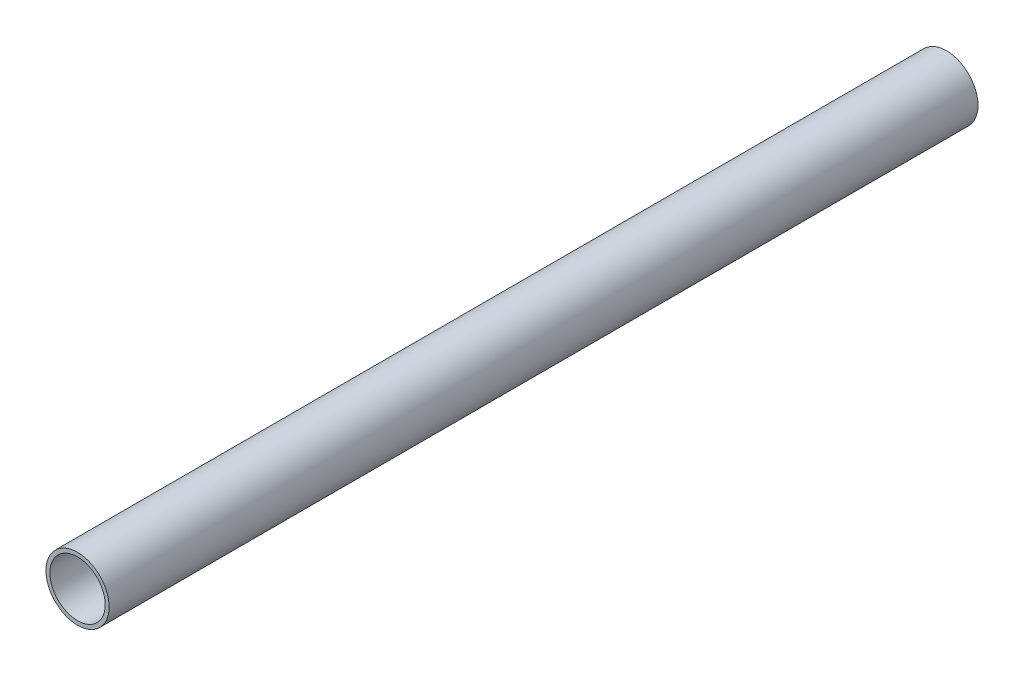
ISO-10303-21;
HEADER;
FILE_DESCRIPTION(('STEP AP214'),'2;1');
FILE_NAME('part.step','',(''),(''),'','','');
FILE_SCHEMA(('AUTOMOTIVE_DESIGN { 1 0 10303 214 1 1 1 1 }'));
ENDSEC;
DATA;
#1=APPLICATION_CONTEXT('core data for automotive mechanical design processes');
#2=APPLICATION_PROTOCOL_DEFINITION('international standard','automotive_design',2000,#1);
#3=PRODUCT_CONTEXT('',#1,'mechanical');
#4=PRODUCT('Part','Part','',(#3));
#5=PRODUCT_RELATED_PRODUCT_CATEGORY('part','',(#4));
#6=PRODUCT_DEFINITION_FORMATION('','',#4);
#7=PRODUCT_DEFINITION_CONTEXT('part definition',#1,'design');
#8=PRODUCT_DEFINITION('design','',#6,#7);
#9=PRODUCT_DEFINITION_SHAPE('','',#8);
#10=(LENGTH_UNIT() NAMED_UNIT(*) SI_UNIT(.MILLI.,.METRE.));
#11=(NAMED_UNIT(*) PLANE_ANGLE_UNIT() SI_UNIT($,.RADIAN.));
#12=(NAMED_UNIT(*) SI_UNIT($,.STERADIAN.) SOLID_ANGLE_UNIT());
#13=UNCERTAINTY_MEASURE_WITH_UNIT(LENGTH_MEASURE(1.E-05),#10,'distance_accuracy_value','');
#14=(GEOMETRIC_REPRESENTATION_CONTEXT(3) GLOBAL_UNCERTAINTY_ASSIGNED_CONTEXT((#13)) GLOBAL_UNIT_ASSIGNED_CONTEXT((#10,
#11,#12)) REPRESENTATION_CONTEXT('',''));
#15=CARTESIAN_POINT('',(0.,0.,0.));
#16=DIRECTION('',(0.,0.,1.));
#17=DIRECTION('',(1.,0.,0.));
#18=AXIS2_PLACEMENT_3D('',#15,#16,#17);
#19=CARTESIAN_POINT('',(0.,0.,110.));
#20=DIRECTION('',(0.,0.,1.));
#21=DIRECTION('',(1.,0.,0.));
#22=AXIS2_PLACEMENT_3D('',#19,#20,#21);
#23=PLANE('',#22);
#24=CARTESIAN_POINT('',(0.,0.,110.));
#25=DIRECTION('',(0.,0.,1.));
#26=DIRECTION('',(1.,0.,0.));
#27=AXIS2_PLACEMENT_3D('',#24,#25,#26);
#28=CIRCLE('',#27,8.);
#29=CARTESIAN_POINT('',(8.,0.,110.));
#30=VERTEX_POINT('',#29);
#31=EDGE_CURVE('E10',#30,#30,#28,.T.);
#32=ORIENTED_EDGE('',*,*,#31,.T.);
#33=EDGE_LOOP('',(#32));
#34=FACE_BOUND('',#33,.T.);
#35=CARTESIAN_POINT('',(0.,0.,110.));
#36=DIRECTION('',(0.,0.,1.));
#37=DIRECTION('',(1.,0.,0.));
#38=AXIS2_PLACEMENT_3D('',#35,#36,#37);
#39=CIRCLE('',#38,7.);
#40=CARTESIAN_POINT('',(7.,0.,110.));
#41=VERTEX_POINT('',#40);
#42=EDGE_CURVE('E44',#41,#41,#39,.T.);
#43=ORIENTED_EDGE('',*,*,#42,.F.);
#44=EDGE_LOOP('',(#43));
#45=FACE_BOUND('',#44,.T.);
#46=ADVANCED_FACE('F33',(#34,#45),#23,.T.);
#47=CARTESIAN_POINT('',(0.,0.,-110.));
#48=DIRECTION('',(0.,0.,1.));
#49=DIRECTION('',(1.,0.,0.));
#50=AXIS2_PLACEMENT_3D('',#47,#48,#49);
#51=PLANE('',#50);
#52=CARTESIAN_POINT('',(0.,0.,-110.));
#53=DIRECTION('',(0.,0.,1.));
#54=DIRECTION('',(1.,0.,0.));
#55=AXIS2_PLACEMENT_3D('',#52,#53,#54);
#56=CIRCLE('',#55,8.);
#57=CARTESIAN_POINT('',(8.,0.,-110.));
#58=VERTEX_POINT('',#57);
#59=EDGE_CURVE('E37',#58,#58,#56,.T.);
#60=ORIENTED_EDGE('',*,*,#59,.F.);
#61=EDGE_LOOP('',(#60));
#62=FACE_BOUND('',#61,.T.);
#63=CARTESIAN_POINT('',(0.,0.,-110.));
#64=DIRECTION('',(0.,0.,1.));
#65=DIRECTION('',(1.,0.,0.));
#66=AXIS2_PLACEMENT_3D('',#63,#64,#65);
#67=CIRCLE('',#66,7.);
#68=CARTESIAN_POINT('',(7.,0.,-110.));
#69=VERTEX_POINT('',#68);
#70=EDGE_CURVE('E46',#69,#69,#67,.T.);
#71=ORIENTED_EDGE('',*,*,#70,.T.);
#72=EDGE_LOOP('',(#71));
#73=FACE_BOUND('',#72,.T.);
#74=ADVANCED_FACE('F56',(#62,#73),#51,.F.);
#75=CARTESIAN_POINT('',(0.,0.,110.));
#76=DIRECTION('',(0.,0.,-1.));
#77=DIRECTION('',(-1.,0.,0.));
#78=AXIS2_PLACEMENT_3D('',#75,#76,#77);
#79=CYLINDRICAL_SURFACE('',#78,8.);
#80=ORIENTED_EDGE('',*,*,#31,.F.);
#81=EDGE_LOOP('',(#80));
#82=FACE_BOUND('',#81,.T.);
#83=ORIENTED_EDGE('',*,*,#59,.T.);
#84=EDGE_LOOP('',(#83));
#85=FACE_BOUND('',#84,.T.);
#86=ADVANCED_FACE('F35',(#82,#85),#79,.T.);
#87=CARTESIAN_POINT('',(0.,0.,110.));
#88=DIRECTION('',(0.,0.,-1.));
#89=DIRECTION('',(-1.,0.,0.));
#90=AXIS2_PLACEMENT_3D('',#87,#88,#89);
#91=CYLINDRICAL_SURFACE('',#90,7.);
#92=ORIENTED_EDGE('',*,*,#42,.T.);
#93=EDGE_LOOP('',(#92));
#94=FACE_BOUND('',#93,.T.);
#95=ORIENTED_EDGE('',*,*,#70,.F.);
#96=EDGE_LOOP('',(#95));
#97=FACE_BOUND('',#96,.T.);
#98=ADVANCED_FACE('F52',(#94,#97),#91,.F.);
#99=CLOSED_SHELL('',(#46,#74,#86,#98));
#100=MANIFOLD_SOLID_BREP('B2',#99);
#101=ADVANCED_BREP_SHAPE_REPRESENTATION('',(#18,#100),#14);
#102=SHAPE_DEFINITION_REPRESENTATION(#9,#101);
ENDSEC;
END-ISO-10303-21;
